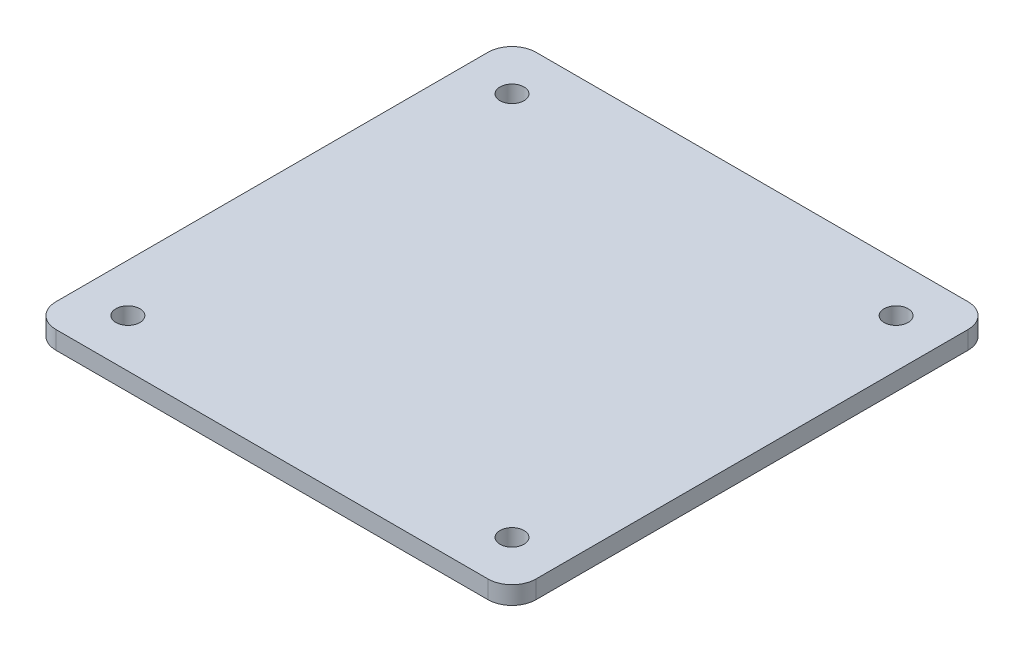
ISO-10303-21;
HEADER;
FILE_DESCRIPTION(('STEP AP214'),'2;1');
FILE_NAME('part.step','',(''),(''),'','','');
FILE_SCHEMA(('AUTOMOTIVE_DESIGN { 1 0 10303 214 1 1 1 1 }'));
ENDSEC;
DATA;
#1=APPLICATION_CONTEXT('core data for automotive mechanical design processes');
#2=APPLICATION_PROTOCOL_DEFINITION('international standard','automotive_design',2000,#1);
#3=PRODUCT_CONTEXT('',#1,'mechanical');
#4=PRODUCT('Part','Part','',(#3));
#5=PRODUCT_RELATED_PRODUCT_CATEGORY('part','',(#4));
#6=PRODUCT_DEFINITION_FORMATION('','',#4);
#7=PRODUCT_DEFINITION_CONTEXT('part definition',#1,'design');
#8=PRODUCT_DEFINITION('design','',#6,#7);
#9=PRODUCT_DEFINITION_SHAPE('','',#8);
#10=(LENGTH_UNIT() NAMED_UNIT(*) SI_UNIT(.MILLI.,.METRE.));
#11=(NAMED_UNIT(*) PLANE_ANGLE_UNIT() SI_UNIT($,.RADIAN.));
#12=(NAMED_UNIT(*) SI_UNIT($,.STERADIAN.) SOLID_ANGLE_UNIT());
#13=UNCERTAINTY_MEASURE_WITH_UNIT(LENGTH_MEASURE(1.E-05),#10,'distance_accuracy_value','');
#14=(GEOMETRIC_REPRESENTATION_CONTEXT(3) GLOBAL_UNCERTAINTY_ASSIGNED_CONTEXT((#13)) GLOBAL_UNIT_ASSIGNED_CONTEXT((#10,
#11,#12)) REPRESENTATION_CONTEXT('',''));
#15=CARTESIAN_POINT('',(0.,0.,0.));
#16=DIRECTION('',(0.,0.,1.));
#17=DIRECTION('',(1.,0.,0.));
#18=AXIS2_PLACEMENT_3D('',#15,#16,#17);
#19=CARTESIAN_POINT('',(36.,3.,-36.));
#20=DIRECTION('',(0.,-1.,0.));
#21=DIRECTION('',(0.,0.,-1.));
#22=AXIS2_PLACEMENT_3D('',#19,#20,#21);
#23=CYLINDRICAL_SURFACE('',#22,4.);
#24=CARTESIAN_POINT('',(36.,0.,-36.));
#25=DIRECTION('',(0.,1.,0.));
#26=DIRECTION('',(0.,0.,-1.));
#27=AXIS2_PLACEMENT_3D('',#24,#25,#26);
#28=CIRCLE('',#27,4.);
#29=CARTESIAN_POINT('',(40.,0.,-36.));
#30=VERTEX_POINT('',#29);
#31=CARTESIAN_POINT('',(36.,0.,-40.));
#32=VERTEX_POINT('',#31);
#33=EDGE_CURVE('E128',#30,#32,#28,.T.);
#34=ORIENTED_EDGE('',*,*,#33,.T.);
#35=DIRECTION('',(0.,-1.,0.));
#36=VECTOR('',#35,1.);
#37=CARTESIAN_POINT('',(36.,3.,-40.));
#38=LINE('',#37,#36);
#39=CARTESIAN_POINT('',(36.,3.,-40.));
#40=VERTEX_POINT('',#39);
#41=EDGE_CURVE('E11',#40,#32,#38,.T.);
#42=ORIENTED_EDGE('',*,*,#41,.F.);
#43=CARTESIAN_POINT('',(36.,3.,-36.));
#44=DIRECTION('',(0.,1.,0.));
#45=DIRECTION('',(0.,0.,-1.));
#46=AXIS2_PLACEMENT_3D('',#43,#44,#45);
#47=CIRCLE('',#46,4.);
#48=CARTESIAN_POINT('',(40.,3.,-36.));
#49=VERTEX_POINT('',#48);
#50=EDGE_CURVE('E143',#49,#40,#47,.T.);
#51=ORIENTED_EDGE('',*,*,#50,.F.);
#52=DIRECTION('',(0.,-1.,0.));
#53=VECTOR('',#52,1.);
#54=CARTESIAN_POINT('',(40.,3.,-36.));
#55=LINE('',#54,#53);
#56=EDGE_CURVE('E124',#49,#30,#55,.T.);
#57=ORIENTED_EDGE('',*,*,#56,.T.);
#58=EDGE_LOOP('',(#34,#42,#51,#57));
#59=FACE_BOUND('',#58,.T.);
#60=ADVANCED_FACE('F32',(#59),#23,.T.);
#61=CARTESIAN_POINT('',(-36.,3.,-40.));
#62=DIRECTION('',(0.,0.,1.));
#63=DIRECTION('',(1.,0.,0.));
#64=AXIS2_PLACEMENT_3D('',#61,#62,#63);
#65=PLANE('',#64);
#66=DIRECTION('',(-1.,0.,0.));
#67=VECTOR('',#66,1.);
#68=CARTESIAN_POINT('',(-36.,0.,-40.));
#69=LINE('',#68,#67);
#70=CARTESIAN_POINT('',(-36.,0.,-40.));
#71=VERTEX_POINT('',#70);
#72=EDGE_CURVE('E131',#32,#71,#69,.T.);
#73=ORIENTED_EDGE('',*,*,#72,.T.);
#74=DIRECTION('',(0.,-1.,0.));
#75=VECTOR('',#74,1.);
#76=CARTESIAN_POINT('',(-36.,3.,-40.));
#77=LINE('',#76,#75);
#78=CARTESIAN_POINT('',(-36.,3.,-40.));
#79=VERTEX_POINT('',#78);
#80=EDGE_CURVE('E40',#79,#71,#77,.T.);
#81=ORIENTED_EDGE('',*,*,#80,.F.);
#82=DIRECTION('',(-1.,0.,0.));
#83=VECTOR('',#82,1.);
#84=CARTESIAN_POINT('',(-36.,3.,-40.));
#85=LINE('',#84,#83);
#86=EDGE_CURVE('E91',#40,#79,#85,.T.);
#87=ORIENTED_EDGE('',*,*,#86,.F.);
#88=ORIENTED_EDGE('',*,*,#41,.T.);
#89=EDGE_LOOP('',(#73,#81,#87,#88));
#90=FACE_BOUND('',#89,.T.);
#91=ADVANCED_FACE('F233',(#90),#65,.F.);
#92=CARTESIAN_POINT('',(-36.,3.,-36.));
#93=DIRECTION('',(0.,-1.,0.));
#94=DIRECTION('',(0.,0.,-1.));
#95=AXIS2_PLACEMENT_3D('',#92,#93,#94);
#96=CYLINDRICAL_SURFACE('',#95,4.);
#97=CARTESIAN_POINT('',(-36.,0.,-36.));
#98=DIRECTION('',(0.,1.,0.));
#99=DIRECTION('',(0.,0.,1.));
#100=AXIS2_PLACEMENT_3D('',#97,#98,#99);
#101=CIRCLE('',#100,4.);
#102=CARTESIAN_POINT('',(-40.,0.,-36.));
#103=VERTEX_POINT('',#102);
#104=EDGE_CURVE('E134',#71,#103,#101,.T.);
#105=ORIENTED_EDGE('',*,*,#104,.T.);
#106=DIRECTION('',(0.,-1.,0.));
#107=VECTOR('',#106,1.);
#108=CARTESIAN_POINT('',(-40.,3.,-36.));
#109=LINE('',#108,#107);
#110=CARTESIAN_POINT('',(-40.,3.,-36.));
#111=VERTEX_POINT('',#110);
#112=EDGE_CURVE('E150',#111,#103,#109,.T.);
#113=ORIENTED_EDGE('',*,*,#112,.F.);
#114=CARTESIAN_POINT('',(-36.,3.,-36.));
#115=DIRECTION('',(0.,1.,0.));
#116=DIRECTION('',(0.,0.,1.));
#117=AXIS2_PLACEMENT_3D('',#114,#115,#116);
#118=CIRCLE('',#117,4.);
#119=EDGE_CURVE('E158',#79,#111,#118,.T.);
#120=ORIENTED_EDGE('',*,*,#119,.F.);
#121=ORIENTED_EDGE('',*,*,#80,.T.);
#122=EDGE_LOOP('',(#105,#113,#120,#121));
#123=FACE_BOUND('',#122,.T.);
#124=ADVANCED_FACE('F156',(#123),#96,.T.);
#125=CARTESIAN_POINT('',(-40.,3.,-36.));
#126=DIRECTION('',(1.,0.,0.));
#127=DIRECTION('',(0.,0.,-1.));
#128=AXIS2_PLACEMENT_3D('',#125,#126,#127);
#129=PLANE('',#128);
#130=DIRECTION('',(0.,0.,1.));
#131=VECTOR('',#130,1.);
#132=CARTESIAN_POINT('',(-40.,0.,-36.));
#133=LINE('',#132,#131);
#134=CARTESIAN_POINT('',(-40.,0.,36.));
#135=VERTEX_POINT('',#134);
#136=EDGE_CURVE('E136',#103,#135,#133,.T.);
#137=ORIENTED_EDGE('',*,*,#136,.T.);
#138=DIRECTION('',(0.,-1.,0.));
#139=VECTOR('',#138,1.);
#140=CARTESIAN_POINT('',(-40.,3.,36.));
#141=LINE('',#140,#139);
#142=CARTESIAN_POINT('',(-40.,3.,36.));
#143=VERTEX_POINT('',#142);
#144=EDGE_CURVE('E147',#143,#135,#141,.T.);
#145=ORIENTED_EDGE('',*,*,#144,.F.);
#146=DIRECTION('',(0.,0.,1.));
#147=VECTOR('',#146,1.);
#148=CARTESIAN_POINT('',(-40.,3.,-36.));
#149=LINE('',#148,#147);
#150=EDGE_CURVE('E170',#111,#143,#149,.T.);
#151=ORIENTED_EDGE('',*,*,#150,.F.);
#152=ORIENTED_EDGE('',*,*,#112,.T.);
#153=EDGE_LOOP('',(#137,#145,#151,#152));
#154=FACE_BOUND('',#153,.T.);
#155=ADVANCED_FACE('F166',(#154),#129,.F.);
#156=CARTESIAN_POINT('',(-36.,3.,36.));
#157=DIRECTION('',(0.,-1.,0.));
#158=DIRECTION('',(0.,0.,-1.));
#159=AXIS2_PLACEMENT_3D('',#156,#157,#158);
#160=CYLINDRICAL_SURFACE('',#159,4.);
#161=CARTESIAN_POINT('',(-36.,0.,36.));
#162=DIRECTION('',(0.,1.,0.));
#163=DIRECTION('',(0.,0.,1.));
#164=AXIS2_PLACEMENT_3D('',#161,#162,#163);
#165=CIRCLE('',#164,4.);
#166=CARTESIAN_POINT('',(-36.,0.,40.));
#167=VERTEX_POINT('',#166);
#168=EDGE_CURVE('E138',#135,#167,#165,.T.);
#169=ORIENTED_EDGE('',*,*,#168,.T.);
#170=DIRECTION('',(0.,-1.,0.));
#171=VECTOR('',#170,1.);
#172=CARTESIAN_POINT('',(-36.,3.,40.));
#173=LINE('',#172,#171);
#174=CARTESIAN_POINT('',(-36.,3.,40.));
#175=VERTEX_POINT('',#174);
#176=EDGE_CURVE('E119',#175,#167,#173,.T.);
#177=ORIENTED_EDGE('',*,*,#176,.F.);
#178=CARTESIAN_POINT('',(-36.,3.,36.));
#179=DIRECTION('',(0.,1.,0.));
#180=DIRECTION('',(0.,0.,1.));
#181=AXIS2_PLACEMENT_3D('',#178,#179,#180);
#182=CIRCLE('',#181,4.);
#183=EDGE_CURVE('E110',#143,#175,#182,.T.);
#184=ORIENTED_EDGE('',*,*,#183,.F.);
#185=ORIENTED_EDGE('',*,*,#144,.T.);
#186=EDGE_LOOP('',(#169,#177,#184,#185));
#187=FACE_BOUND('',#186,.T.);
#188=ADVANCED_FACE('F169',(#187),#160,.T.);
#189=CARTESIAN_POINT('',(-36.,3.,40.));
#190=DIRECTION('',(0.,0.,-1.));
#191=DIRECTION('',(-1.,0.,0.));
#192=AXIS2_PLACEMENT_3D('',#189,#190,#191);
#193=PLANE('',#192);
#194=DIRECTION('',(1.,0.,0.));
#195=VECTOR('',#194,1.);
#196=CARTESIAN_POINT('',(-36.,0.,40.));
#197=LINE('',#196,#195);
#198=CARTESIAN_POINT('',(36.,0.,40.));
#199=VERTEX_POINT('',#198);
#200=EDGE_CURVE('E118',#167,#199,#197,.T.);
#201=ORIENTED_EDGE('',*,*,#200,.T.);
#202=DIRECTION('',(0.,-1.,0.));
#203=VECTOR('',#202,1.);
#204=CARTESIAN_POINT('',(36.,3.,40.));
#205=LINE('',#204,#203);
#206=CARTESIAN_POINT('',(36.,3.,40.));
#207=VERTEX_POINT('',#206);
#208=EDGE_CURVE('E115',#207,#199,#205,.T.);
#209=ORIENTED_EDGE('',*,*,#208,.F.);
#210=DIRECTION('',(1.,0.,0.));
#211=VECTOR('',#210,1.);
#212=CARTESIAN_POINT('',(-36.,3.,40.));
#213=LINE('',#212,#211);
#214=EDGE_CURVE('E104',#175,#207,#213,.T.);
#215=ORIENTED_EDGE('',*,*,#214,.F.);
#216=ORIENTED_EDGE('',*,*,#176,.T.);
#217=EDGE_LOOP('',(#201,#209,#215,#216));
#218=FACE_BOUND('',#217,.T.);
#219=ADVANCED_FACE('F116',(#218),#193,.F.);
#220=CARTESIAN_POINT('',(36.,3.,36.));
#221=DIRECTION('',(0.,-1.,0.));
#222=DIRECTION('',(0.,0.,-1.));
#223=AXIS2_PLACEMENT_3D('',#220,#221,#222);
#224=CYLINDRICAL_SURFACE('',#223,4.);
#225=CARTESIAN_POINT('',(36.,0.,36.));
#226=DIRECTION('',(0.,1.,0.));
#227=DIRECTION('',(0.,0.,1.));
#228=AXIS2_PLACEMENT_3D('',#225,#226,#227);
#229=CIRCLE('',#228,4.);
#230=CARTESIAN_POINT('',(40.,0.,36.));
#231=VERTEX_POINT('',#230);
#232=EDGE_CURVE('E77',#199,#231,#229,.T.);
#233=ORIENTED_EDGE('',*,*,#232,.T.);
#234=DIRECTION('',(0.,-1.,0.));
#235=VECTOR('',#234,1.);
#236=CARTESIAN_POINT('',(40.,3.,36.));
#237=LINE('',#236,#235);
#238=CARTESIAN_POINT('',(40.,3.,36.));
#239=VERTEX_POINT('',#238);
#240=EDGE_CURVE('E120',#239,#231,#237,.T.);
#241=ORIENTED_EDGE('',*,*,#240,.F.);
#242=CARTESIAN_POINT('',(36.,3.,36.));
#243=DIRECTION('',(0.,1.,0.));
#244=DIRECTION('',(0.,0.,1.));
#245=AXIS2_PLACEMENT_3D('',#242,#243,#244);
#246=CIRCLE('',#245,4.);
#247=EDGE_CURVE('E108',#207,#239,#246,.T.);
#248=ORIENTED_EDGE('',*,*,#247,.F.);
#249=ORIENTED_EDGE('',*,*,#208,.T.);
#250=EDGE_LOOP('',(#233,#241,#248,#249));
#251=FACE_BOUND('',#250,.T.);
#252=ADVANCED_FACE('F122',(#251),#224,.T.);
#253=CARTESIAN_POINT('',(40.,3.,-36.));
#254=DIRECTION('',(-1.,0.,0.));
#255=DIRECTION('',(0.,0.,1.));
#256=AXIS2_PLACEMENT_3D('',#253,#254,#255);
#257=PLANE('',#256);
#258=DIRECTION('',(0.,0.,-1.));
#259=VECTOR('',#258,1.);
#260=CARTESIAN_POINT('',(40.,0.,-36.));
#261=LINE('',#260,#259);
#262=EDGE_CURVE('E83',#231,#30,#261,.T.);
#263=ORIENTED_EDGE('',*,*,#262,.T.);
#264=ORIENTED_EDGE('',*,*,#56,.F.);
#265=DIRECTION('',(0.,0.,-1.));
#266=VECTOR('',#265,1.);
#267=CARTESIAN_POINT('',(40.,3.,-36.));
#268=LINE('',#267,#266);
#269=EDGE_CURVE('E48',#239,#49,#268,.T.);
#270=ORIENTED_EDGE('',*,*,#269,.F.);
#271=ORIENTED_EDGE('',*,*,#240,.T.);
#272=EDGE_LOOP('',(#263,#264,#270,#271));
#273=FACE_BOUND('',#272,.T.);
#274=ADVANCED_FACE('F211',(#273),#257,.F.);
#275=CARTESIAN_POINT('',(36.,3.,-36.));
#276=DIRECTION('',(0.,-1.,0.));
#277=DIRECTION('',(0.,0.,-1.));
#278=AXIS2_PLACEMENT_3D('',#275,#276,#277);
#279=PLANE('',#278);
#280=CARTESIAN_POINT('',(32.,3.,-32.000000000002));
#281=DIRECTION('',(0.,1.,0.));
#282=DIRECTION('',(0.,0.,1.));
#283=AXIS2_PLACEMENT_3D('',#280,#281,#282);
#284=CIRCLE('',#283,2.);
#285=CARTESIAN_POINT('',(32.,3.,-30.000000000002));
#286=VERTEX_POINT('',#285);
#287=EDGE_CURVE('E194',#286,#286,#284,.T.);
#288=ORIENTED_EDGE('',*,*,#287,.F.);
#289=EDGE_LOOP('',(#288));
#290=FACE_BOUND('',#289,.T.);
#291=CARTESIAN_POINT('',(32.000000000002,3.,31.999999999998));
#292=DIRECTION('',(0.,1.,0.));
#293=DIRECTION('',(0.,0.,1.));
#294=AXIS2_PLACEMENT_3D('',#291,#292,#293);
#295=CIRCLE('',#294,2.);
#296=CARTESIAN_POINT('',(32.000000000002,3.,33.999999999998));
#297=VERTEX_POINT('',#296);
#298=EDGE_CURVE('E188',#297,#297,#295,.T.);
#299=ORIENTED_EDGE('',*,*,#298,.F.);
#300=EDGE_LOOP('',(#299));
#301=FACE_BOUND('',#300,.T.);
#302=CARTESIAN_POINT('',(-31.999999999998,3.,32.));
#303=DIRECTION('',(0.,1.,0.));
#304=DIRECTION('',(0.,0.,1.));
#305=AXIS2_PLACEMENT_3D('',#302,#303,#304);
#306=CIRCLE('',#305,2.);
#307=CARTESIAN_POINT('',(-31.999999999998,3.,34.));
#308=VERTEX_POINT('',#307);
#309=EDGE_CURVE('E182',#308,#308,#306,.T.);
#310=ORIENTED_EDGE('',*,*,#309,.F.);
#311=EDGE_LOOP('',(#310));
#312=FACE_BOUND('',#311,.T.);
#313=CARTESIAN_POINT('',(-32.,3.,-32.));
#314=DIRECTION('',(0.,1.,0.));
#315=DIRECTION('',(0.,0.,1.));
#316=AXIS2_PLACEMENT_3D('',#313,#314,#315);
#317=CIRCLE('',#316,2.);
#318=CARTESIAN_POINT('',(-32.,3.,-30.));
#319=VERTEX_POINT('',#318);
#320=EDGE_CURVE('E176',#319,#319,#317,.T.);
#321=ORIENTED_EDGE('',*,*,#320,.F.);
#322=EDGE_LOOP('',(#321));
#323=FACE_BOUND('',#322,.T.);
#324=ORIENTED_EDGE('',*,*,#50,.T.);
#325=ORIENTED_EDGE('',*,*,#86,.T.);
#326=ORIENTED_EDGE('',*,*,#119,.T.);
#327=ORIENTED_EDGE('',*,*,#150,.T.);
#328=ORIENTED_EDGE('',*,*,#183,.T.);
#329=ORIENTED_EDGE('',*,*,#214,.T.);
#330=ORIENTED_EDGE('',*,*,#247,.T.);
#331=ORIENTED_EDGE('',*,*,#269,.T.);
#332=EDGE_LOOP('',(#324,#325,#326,#327,#328,#329,#330,#331));
#333=FACE_BOUND('',#332,.T.);
#334=ADVANCED_FACE('F106',(#290,#301,#312,#323,#333),#279,.F.);
#335=CARTESIAN_POINT('',(36.,0.,-36.));
#336=DIRECTION('',(0.,-1.,0.));
#337=DIRECTION('',(0.,0.,-1.));
#338=AXIS2_PLACEMENT_3D('',#335,#336,#337);
#339=PLANE('',#338);
#340=CARTESIAN_POINT('',(32.,0.,-32.000000000002));
#341=DIRECTION('',(0.,1.,0.));
#342=DIRECTION('',(0.,0.,1.));
#343=AXIS2_PLACEMENT_3D('',#340,#341,#342);
#344=CIRCLE('',#343,2.);
#345=CARTESIAN_POINT('',(32.,0.,-30.000000000002));
#346=VERTEX_POINT('',#345);
#347=EDGE_CURVE('E179',#346,#346,#344,.T.);
#348=ORIENTED_EDGE('',*,*,#347,.T.);
#349=EDGE_LOOP('',(#348));
#350=FACE_BOUND('',#349,.T.);
#351=CARTESIAN_POINT('',(32.000000000002,0.,31.999999999998));
#352=DIRECTION('',(0.,1.,0.));
#353=DIRECTION('',(0.,0.,1.));
#354=AXIS2_PLACEMENT_3D('',#351,#352,#353);
#355=CIRCLE('',#354,2.);
#356=CARTESIAN_POINT('',(32.000000000002,0.,33.999999999998));
#357=VERTEX_POINT('',#356);
#358=EDGE_CURVE('E191',#357,#357,#355,.T.);
#359=ORIENTED_EDGE('',*,*,#358,.T.);
#360=EDGE_LOOP('',(#359));
#361=FACE_BOUND('',#360,.T.);
#362=CARTESIAN_POINT('',(-31.999999999998,0.,32.));
#363=DIRECTION('',(0.,1.,0.));
#364=DIRECTION('',(0.,0.,1.));
#365=AXIS2_PLACEMENT_3D('',#362,#363,#364);
#366=CIRCLE('',#365,2.);
#367=CARTESIAN_POINT('',(-31.999999999998,0.,34.));
#368=VERTEX_POINT('',#367);
#369=EDGE_CURVE('E185',#368,#368,#366,.T.);
#370=ORIENTED_EDGE('',*,*,#369,.T.);
#371=EDGE_LOOP('',(#370));
#372=FACE_BOUND('',#371,.T.);
#373=CARTESIAN_POINT('',(-32.,0.,-32.));
#374=DIRECTION('',(0.,1.,0.));
#375=DIRECTION('',(0.,0.,1.));
#376=AXIS2_PLACEMENT_3D('',#373,#374,#375);
#377=CIRCLE('',#376,2.);
#378=CARTESIAN_POINT('',(-32.,0.,-30.));
#379=VERTEX_POINT('',#378);
#380=EDGE_CURVE('E132',#379,#379,#377,.T.);
#381=ORIENTED_EDGE('',*,*,#380,.T.);
#382=EDGE_LOOP('',(#381));
#383=FACE_BOUND('',#382,.T.);
#384=ORIENTED_EDGE('',*,*,#33,.F.);
#385=ORIENTED_EDGE('',*,*,#262,.F.);
#386=ORIENTED_EDGE('',*,*,#232,.F.);
#387=ORIENTED_EDGE('',*,*,#200,.F.);
#388=ORIENTED_EDGE('',*,*,#168,.F.);
#389=ORIENTED_EDGE('',*,*,#136,.F.);
#390=ORIENTED_EDGE('',*,*,#104,.F.);
#391=ORIENTED_EDGE('',*,*,#72,.F.);
#392=EDGE_LOOP('',(#384,#385,#386,#387,#388,#389,#390,#391));
#393=FACE_BOUND('',#392,.T.);
#394=ADVANCED_FACE('F162',(#350,#361,#372,#383,#393),#339,.T.);
#395=CARTESIAN_POINT('',(-32.,0.,-32.));
#396=DIRECTION('',(0.,1.,0.));
#397=DIRECTION('',(0.,0.,1.));
#398=AXIS2_PLACEMENT_3D('',#395,#396,#397);
#399=CYLINDRICAL_SURFACE('',#398,2.);
#400=ORIENTED_EDGE('',*,*,#380,.F.);
#401=EDGE_LOOP('',(#400));
#402=FACE_BOUND('',#401,.T.);
#403=ORIENTED_EDGE('',*,*,#320,.T.);
#404=EDGE_LOOP('',(#403));
#405=FACE_BOUND('',#404,.T.);
#406=ADVANCED_FACE('F219',(#402,#405),#399,.F.);
#407=CARTESIAN_POINT('',(-31.999999999998,0.,32.));
#408=DIRECTION('',(0.,1.,0.));
#409=DIRECTION('',(0.,0.,1.));
#410=AXIS2_PLACEMENT_3D('',#407,#408,#409);
#411=CYLINDRICAL_SURFACE('',#410,2.);
#412=ORIENTED_EDGE('',*,*,#369,.F.);
#413=EDGE_LOOP('',(#412));
#414=FACE_BOUND('',#413,.T.);
#415=ORIENTED_EDGE('',*,*,#309,.T.);
#416=EDGE_LOOP('',(#415));
#417=FACE_BOUND('',#416,.T.);
#418=ADVANCED_FACE('F221',(#414,#417),#411,.F.);
#419=CARTESIAN_POINT('',(32.000000000002,0.,31.999999999998));
#420=DIRECTION('',(0.,1.,0.));
#421=DIRECTION('',(0.,0.,1.));
#422=AXIS2_PLACEMENT_3D('',#419,#420,#421);
#423=CYLINDRICAL_SURFACE('',#422,2.);
#424=ORIENTED_EDGE('',*,*,#358,.F.);
#425=EDGE_LOOP('',(#424));
#426=FACE_BOUND('',#425,.T.);
#427=ORIENTED_EDGE('',*,*,#298,.T.);
#428=EDGE_LOOP('',(#427));
#429=FACE_BOUND('',#428,.T.);
#430=ADVANCED_FACE('F205',(#426,#429),#423,.F.);
#431=CARTESIAN_POINT('',(32.,0.,-32.000000000002));
#432=DIRECTION('',(0.,1.,0.));
#433=DIRECTION('',(0.,0.,1.));
#434=AXIS2_PLACEMENT_3D('',#431,#432,#433);
#435=CYLINDRICAL_SURFACE('',#434,2.);
#436=ORIENTED_EDGE('',*,*,#347,.F.);
#437=EDGE_LOOP('',(#436));
#438=FACE_BOUND('',#437,.T.);
#439=ORIENTED_EDGE('',*,*,#287,.T.);
#440=EDGE_LOOP('',(#439));
#441=FACE_BOUND('',#440,.T.);
#442=ADVANCED_FACE('F202',(#438,#441),#435,.F.);
#443=CLOSED_SHELL('',(#60,#91,#124,#155,#188,#219,#252,#274,#334,#394,#406,#418,#430,#442));
#444=MANIFOLD_SOLID_BREP('B2',#443);
#445=ADVANCED_BREP_SHAPE_REPRESENTATION('',(#18,#444),#14);
#446=SHAPE_DEFINITION_REPRESENTATION(#9,#445);
ENDSEC;
END-ISO-10303-21;
